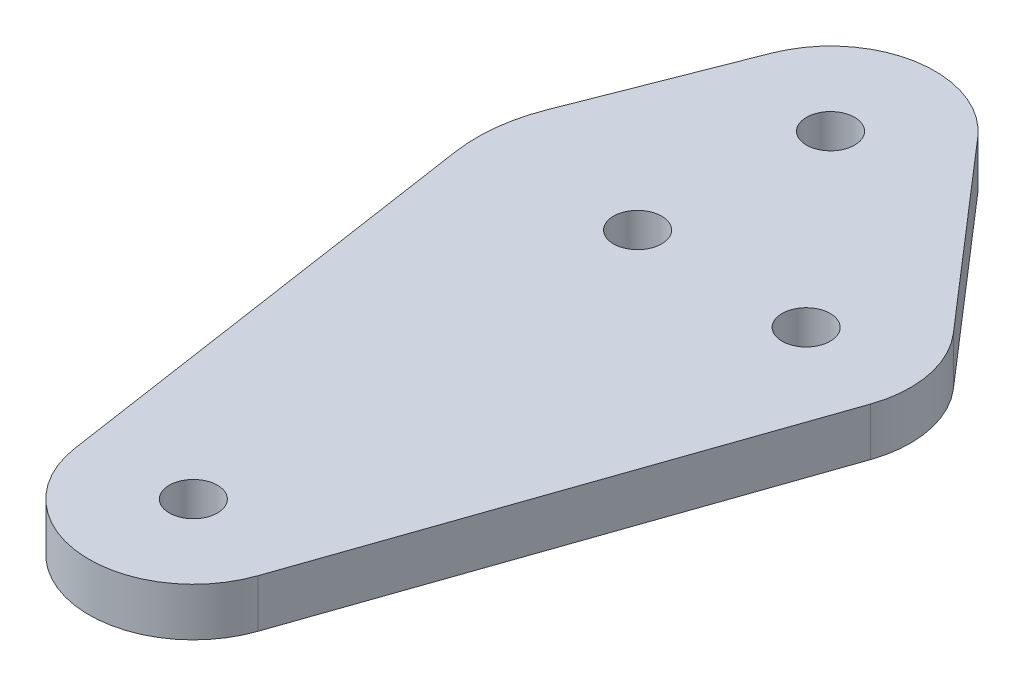
ISO-10303-21;
HEADER;
FILE_DESCRIPTION(('STEP AP214'),'2;1');
FILE_NAME('part.step','',(''),(''),'','','');
FILE_SCHEMA(('AUTOMOTIVE_DESIGN { 1 0 10303 214 1 1 1 1 }'));
ENDSEC;
DATA;
#1=APPLICATION_CONTEXT('core data for automotive mechanical design processes');
#2=APPLICATION_PROTOCOL_DEFINITION('international standard','automotive_design',2000,#1);
#3=PRODUCT_CONTEXT('',#1,'mechanical');
#4=PRODUCT('Part','Part','',(#3));
#5=PRODUCT_RELATED_PRODUCT_CATEGORY('part','',(#4));
#6=PRODUCT_DEFINITION_FORMATION('','',#4);
#7=PRODUCT_DEFINITION_CONTEXT('part definition',#1,'design');
#8=PRODUCT_DEFINITION('design','',#6,#7);
#9=PRODUCT_DEFINITION_SHAPE('','',#8);
#10=(LENGTH_UNIT() NAMED_UNIT(*) SI_UNIT(.MILLI.,.METRE.));
#11=(NAMED_UNIT(*) PLANE_ANGLE_UNIT() SI_UNIT($,.RADIAN.));
#12=(NAMED_UNIT(*) SI_UNIT($,.STERADIAN.) SOLID_ANGLE_UNIT());
#13=UNCERTAINTY_MEASURE_WITH_UNIT(LENGTH_MEASURE(1.E-05),#10,'distance_accuracy_value','');
#14=(GEOMETRIC_REPRESENTATION_CONTEXT(3) GLOBAL_UNCERTAINTY_ASSIGNED_CONTEXT((#13)) GLOBAL_UNIT_ASSIGNED_CONTEXT((#10,
#11,#12)) REPRESENTATION_CONTEXT('',''));
#15=CARTESIAN_POINT('',(0.,0.,0.));
#16=DIRECTION('',(0.,0.,1.));
#17=DIRECTION('',(1.,0.,0.));
#18=AXIS2_PLACEMENT_3D('',#15,#16,#17);
#19=CARTESIAN_POINT('',(-9.81980506061962,3.,-11.3389341902768));
#20=DIRECTION('',(0.,1.,0.));
#21=DIRECTION('',(0.,0.,1.));
#22=AXIS2_PLACEMENT_3D('',#19,#20,#21);
#23=PLANE('',#22);
#24=CARTESIAN_POINT('',(-9.81980506061962,3.,28.347335475692));
#25=DIRECTION('',(0.,1.,0.));
#26=DIRECTION('',(0.,0.,1.));
#27=AXIS2_PLACEMENT_3D('',#24,#25,#26);
#28=CIRCLE('',#27,1.5);
#29=CARTESIAN_POINT('',(-9.81980506061962,3.,29.8473354756921));
#30=VERTEX_POINT('',#29);
#31=EDGE_CURVE('E188',#30,#30,#28,.T.);
#32=ORIENTED_EDGE('',*,*,#31,.F.);
#33=EDGE_LOOP('',(#32));
#34=FACE_BOUND('',#33,.T.);
#35=CARTESIAN_POINT('',(0.,3.,0.));
#36=DIRECTION('',(0.,1.,0.));
#37=DIRECTION('',(0.,0.,1.));
#38=AXIS2_PLACEMENT_3D('',#35,#36,#37);
#39=CIRCLE('',#38,1.5);
#40=CARTESIAN_POINT('',(0.,3.,1.5));
#41=VERTEX_POINT('',#40);
#42=EDGE_CURVE('E134',#41,#41,#39,.T.);
#43=ORIENTED_EDGE('',*,*,#42,.F.);
#44=EDGE_LOOP('',(#43));
#45=FACE_BOUND('',#44,.T.);
#46=CARTESIAN_POINT('',(-9.81980506061962,3.,-11.3389341902768));
#47=DIRECTION('',(0.,1.,0.));
#48=DIRECTION('',(0.,0.,1.));
#49=AXIS2_PLACEMENT_3D('',#46,#47,#48);
#50=CIRCLE('',#49,6.5);
#51=CARTESIAN_POINT('',(-4.90626691149965,3.,-15.5941830498787));
#52=VERTEX_POINT('',#51);
#53=CARTESIAN_POINT('',(-15.8725485224448,3.,-13.7083848830183));
#54=VERTEX_POINT('',#53);
#55=EDGE_CURVE('E145',#52,#54,#50,.T.);
#56=ORIENTED_EDGE('',*,*,#55,.T.);
#57=DIRECTION('',(-0.364530875806377,0.,0.931191301819253));
#58=VECTOR('',#57,1.);
#59=CARTESIAN_POINT('',(-15.8725485224448,3.,-13.7083848830183));
#60=LINE('',#59,#58);
#61=CARTESIAN_POINT('',(-19.8119130181925,3.,-3.64530875806377));
#62=VERTEX_POINT('',#61);
#63=EDGE_CURVE('E93',#54,#62,#60,.T.);
#64=ORIENTED_EDGE('',*,*,#63,.T.);
#65=CARTESIAN_POINT('',(-10.5,3.,0.));
#66=DIRECTION('',(0.,1.,0.));
#67=DIRECTION('',(0.,0.,1.));
#68=AXIS2_PLACEMENT_3D('',#65,#66,#67);
#69=CIRCLE('',#68,10.);
#70=CARTESIAN_POINT('',(-20.3910644709549,3.,1.4720202550963));
#71=VERTEX_POINT('',#70);
#72=EDGE_CURVE('E160',#62,#71,#69,.T.);
#73=ORIENTED_EDGE('',*,*,#72,.T.);
#74=DIRECTION('',(0.14720202550963,0.,0.989106447095489));
#75=VECTOR('',#74,1.);
#76=CARTESIAN_POINT('',(-20.3910644709549,3.,1.4720202550963));
#77=LINE('',#76,#75);
#78=CARTESIAN_POINT('',(-16.2489969667403,3.,29.3041486415046));
#79=VERTEX_POINT('',#78);
#80=EDGE_CURVE('E173',#71,#79,#77,.T.);
#81=ORIENTED_EDGE('',*,*,#80,.T.);
#82=CARTESIAN_POINT('',(-9.81980506061962,3.,28.347335475692));
#83=DIRECTION('',(0.,1.,0.));
#84=DIRECTION('',(0.,0.,1.));
#85=AXIS2_PLACEMENT_3D('',#82,#83,#84);
#86=CIRCLE('',#85,6.5);
#87=CARTESIAN_POINT('',(-3.67788237421967,3.,30.474959905493));
#88=VERTEX_POINT('',#87);
#89=EDGE_CURVE('E112',#79,#88,#86,.T.);
#90=ORIENTED_EDGE('',*,*,#89,.T.);
#91=DIRECTION('',(0.327326835353987,0.,-0.944911182523068));
#92=VECTOR('',#91,1.);
#93=CARTESIAN_POINT('',(6.14192268639994,3.,2.12762442980092));
#94=LINE('',#93,#92);
#95=CARTESIAN_POINT('',(6.14192268639994,3.,2.12762442980092));
#96=VERTEX_POINT('',#95);
#97=EDGE_CURVE('E106',#88,#96,#94,.T.);
#98=ORIENTED_EDGE('',*,*,#97,.T.);
#99=CARTESIAN_POINT('',(0.,3.,0.));
#100=DIRECTION('',(0.,1.,0.));
#101=DIRECTION('',(0.,0.,1.));
#102=AXIS2_PLACEMENT_3D('',#99,#100,#101);
#103=CIRCLE('',#102,6.5);
#104=CARTESIAN_POINT('',(4.91353814911997,3.,-4.25524885960184));
#105=VERTEX_POINT('',#104);
#106=EDGE_CURVE('E110',#96,#105,#103,.T.);
#107=ORIENTED_EDGE('',*,*,#106,.T.);
#108=DIRECTION('',(-0.654653670707975,0.,-0.755928946018457));
#109=VECTOR('',#108,1.);
#110=CARTESIAN_POINT('',(-4.90626691149965,3.,-15.5941830498787));
#111=LINE('',#110,#109);
#112=EDGE_CURVE('E50',#105,#52,#111,.T.);
#113=ORIENTED_EDGE('',*,*,#112,.T.);
#114=EDGE_LOOP('',(#56,#64,#73,#81,#90,#98,#107,#113));
#115=FACE_BOUND('',#114,.T.);
#116=CARTESIAN_POINT('',(-9.81980506061962,3.,-11.3389341902768));
#117=DIRECTION('',(0.,1.,0.));
#118=DIRECTION('',(0.,0.,1.));
#119=AXIS2_PLACEMENT_3D('',#116,#117,#118);
#120=CIRCLE('',#119,1.5);
#121=CARTESIAN_POINT('',(-9.81980506061962,3.,-9.83893419027685));
#122=VERTEX_POINT('',#121);
#123=EDGE_CURVE('E182',#122,#122,#120,.T.);
#124=ORIENTED_EDGE('',*,*,#123,.F.);
#125=EDGE_LOOP('',(#124));
#126=FACE_BOUND('',#125,.T.);
#127=CARTESIAN_POINT('',(-10.5,3.,0.));
#128=DIRECTION('',(0.,1.,0.));
#129=DIRECTION('',(0.,0.,1.));
#130=AXIS2_PLACEMENT_3D('',#127,#128,#129);
#131=CIRCLE('',#130,1.5);
#132=CARTESIAN_POINT('',(-10.5,3.,1.5));
#133=VERTEX_POINT('',#132);
#134=EDGE_CURVE('E194',#133,#133,#131,.T.);
#135=ORIENTED_EDGE('',*,*,#134,.F.);
#136=EDGE_LOOP('',(#135));
#137=FACE_BOUND('',#136,.T.);
#138=ADVANCED_FACE('F33',(#34,#45,#115,#126,#137),#23,.T.);
#139=CARTESIAN_POINT('',(-9.81980506061962,0.,-11.3389341902768));
#140=DIRECTION('',(0.,1.,0.));
#141=DIRECTION('',(0.,0.,1.));
#142=AXIS2_PLACEMENT_3D('',#139,#140,#141);
#143=PLANE('',#142);
#144=CARTESIAN_POINT('',(-9.81980506061962,0.,-11.3389341902768));
#145=DIRECTION('',(0.,1.,0.));
#146=DIRECTION('',(0.,0.,1.));
#147=AXIS2_PLACEMENT_3D('',#144,#145,#146);
#148=CIRCLE('',#147,6.5);
#149=CARTESIAN_POINT('',(-4.90626691149965,0.,-15.5941830498787));
#150=VERTEX_POINT('',#149);
#151=CARTESIAN_POINT('',(-15.8725485224448,0.,-13.7083848830183));
#152=VERTEX_POINT('',#151);
#153=EDGE_CURVE('E130',#150,#152,#148,.T.);
#154=ORIENTED_EDGE('',*,*,#153,.F.);
#155=DIRECTION('',(-0.654653670707975,0.,-0.755928946018457));
#156=VECTOR('',#155,1.);
#157=CARTESIAN_POINT('',(-4.90626691149965,0.,-15.5941830498787));
#158=LINE('',#157,#156);
#159=CARTESIAN_POINT('',(4.91353814911997,0.,-4.25524885960184));
#160=VERTEX_POINT('',#159);
#161=EDGE_CURVE('E85',#160,#150,#158,.T.);
#162=ORIENTED_EDGE('',*,*,#161,.F.);
#163=CARTESIAN_POINT('',(0.,0.,0.));
#164=DIRECTION('',(0.,1.,0.));
#165=DIRECTION('',(0.,0.,1.));
#166=AXIS2_PLACEMENT_3D('',#163,#164,#165);
#167=CIRCLE('',#166,6.5);
#168=CARTESIAN_POINT('',(6.14192268639994,0.,2.12762442980092));
#169=VERTEX_POINT('',#168);
#170=EDGE_CURVE('E79',#169,#160,#167,.T.);
#171=ORIENTED_EDGE('',*,*,#170,.F.);
#172=DIRECTION('',(0.327326835353987,0.,-0.944911182523068));
#173=VECTOR('',#172,1.);
#174=CARTESIAN_POINT('',(6.14192268639994,0.,2.12762442980092));
#175=LINE('',#174,#173);
#176=CARTESIAN_POINT('',(-3.67788237421967,0.,30.474959905493));
#177=VERTEX_POINT('',#176);
#178=EDGE_CURVE('E120',#177,#169,#175,.T.);
#179=ORIENTED_EDGE('',*,*,#178,.F.);
#180=CARTESIAN_POINT('',(-9.81980506061962,0.,28.347335475692));
#181=DIRECTION('',(0.,1.,0.));
#182=DIRECTION('',(0.,0.,1.));
#183=AXIS2_PLACEMENT_3D('',#180,#181,#182);
#184=CIRCLE('',#183,6.5);
#185=CARTESIAN_POINT('',(-16.2489969667403,0.,29.3041486415046));
#186=VERTEX_POINT('',#185);
#187=EDGE_CURVE('E140',#186,#177,#184,.T.);
#188=ORIENTED_EDGE('',*,*,#187,.F.);
#189=DIRECTION('',(0.14720202550963,0.,0.989106447095489));
#190=VECTOR('',#189,1.);
#191=CARTESIAN_POINT('',(-20.3910644709549,0.,1.4720202550963));
#192=LINE('',#191,#190);
#193=CARTESIAN_POINT('',(-20.3910644709549,0.,1.4720202550963));
#194=VERTEX_POINT('',#193);
#195=EDGE_CURVE('E138',#194,#186,#192,.T.);
#196=ORIENTED_EDGE('',*,*,#195,.F.);
#197=CARTESIAN_POINT('',(-10.5,0.,0.));
#198=DIRECTION('',(0.,1.,0.));
#199=DIRECTION('',(0.,0.,1.));
#200=AXIS2_PLACEMENT_3D('',#197,#198,#199);
#201=CIRCLE('',#200,10.);
#202=CARTESIAN_POINT('',(-19.8119130181925,0.,-3.64530875806377));
#203=VERTEX_POINT('',#202);
#204=EDGE_CURVE('E136',#203,#194,#201,.T.);
#205=ORIENTED_EDGE('',*,*,#204,.F.);
#206=DIRECTION('',(-0.364530875806377,0.,0.931191301819253));
#207=VECTOR('',#206,1.);
#208=CARTESIAN_POINT('',(-15.8725485224448,0.,-13.7083848830183));
#209=LINE('',#208,#207);
#210=EDGE_CURVE('E133',#152,#203,#209,.T.);
#211=ORIENTED_EDGE('',*,*,#210,.F.);
#212=EDGE_LOOP('',(#154,#162,#171,#179,#188,#196,#205,#211));
#213=FACE_BOUND('',#212,.T.);
#214=CARTESIAN_POINT('',(0.,0.,0.));
#215=DIRECTION('',(0.,1.,0.));
#216=DIRECTION('',(0.,0.,1.));
#217=AXIS2_PLACEMENT_3D('',#214,#215,#216);
#218=CIRCLE('',#217,1.5);
#219=CARTESIAN_POINT('',(0.,0.,1.5));
#220=VERTEX_POINT('',#219);
#221=EDGE_CURVE('E179',#220,#220,#218,.T.);
#222=ORIENTED_EDGE('',*,*,#221,.T.);
#223=EDGE_LOOP('',(#222));
#224=FACE_BOUND('',#223,.T.);
#225=CARTESIAN_POINT('',(-9.81980506061962,0.,-11.3389341902768));
#226=DIRECTION('',(0.,1.,0.));
#227=DIRECTION('',(0.,0.,1.));
#228=AXIS2_PLACEMENT_3D('',#225,#226,#227);
#229=CIRCLE('',#228,1.5);
#230=CARTESIAN_POINT('',(-9.81980506061962,0.,-9.83893419027685));
#231=VERTEX_POINT('',#230);
#232=EDGE_CURVE('E185',#231,#231,#229,.T.);
#233=ORIENTED_EDGE('',*,*,#232,.T.);
#234=EDGE_LOOP('',(#233));
#235=FACE_BOUND('',#234,.T.);
#236=CARTESIAN_POINT('',(-9.81980506061962,0.,28.347335475692));
#237=DIRECTION('',(0.,1.,0.));
#238=DIRECTION('',(0.,0.,1.));
#239=AXIS2_PLACEMENT_3D('',#236,#237,#238);
#240=CIRCLE('',#239,1.5);
#241=CARTESIAN_POINT('',(-9.81980506061962,0.,29.8473354756921));
#242=VERTEX_POINT('',#241);
#243=EDGE_CURVE('E191',#242,#242,#240,.T.);
#244=ORIENTED_EDGE('',*,*,#243,.T.);
#245=EDGE_LOOP('',(#244));
#246=FACE_BOUND('',#245,.T.);
#247=CARTESIAN_POINT('',(-10.5,0.,0.));
#248=DIRECTION('',(0.,1.,0.));
#249=DIRECTION('',(0.,0.,1.));
#250=AXIS2_PLACEMENT_3D('',#247,#248,#249);
#251=CIRCLE('',#250,1.5);
#252=CARTESIAN_POINT('',(-10.5,0.,1.5));
#253=VERTEX_POINT('',#252);
#254=EDGE_CURVE('E197',#253,#253,#251,.T.);
#255=ORIENTED_EDGE('',*,*,#254,.T.);
#256=EDGE_LOOP('',(#255));
#257=FACE_BOUND('',#256,.T.);
#258=ADVANCED_FACE('F164',(#213,#224,#235,#246,#257),#143,.F.);
#259=CARTESIAN_POINT('',(-9.81980506061962,3.,-11.3389341902768));
#260=DIRECTION('',(0.,-1.,0.));
#261=DIRECTION('',(0.,0.,-1.));
#262=AXIS2_PLACEMENT_3D('',#259,#260,#261);
#263=CYLINDRICAL_SURFACE('',#262,6.5);
#264=ORIENTED_EDGE('',*,*,#153,.T.);
#265=DIRECTION('',(0.,-1.,0.));
#266=VECTOR('',#265,1.);
#267=CARTESIAN_POINT('',(-15.8725485224448,3.,-13.7083848830183));
#268=LINE('',#267,#266);
#269=EDGE_CURVE('E11',#54,#152,#268,.T.);
#270=ORIENTED_EDGE('',*,*,#269,.F.);
#271=ORIENTED_EDGE('',*,*,#55,.F.);
#272=DIRECTION('',(0.,-1.,0.));
#273=VECTOR('',#272,1.);
#274=CARTESIAN_POINT('',(-4.90626691149965,3.,-15.5941830498787));
#275=LINE('',#274,#273);
#276=EDGE_CURVE('E126',#52,#150,#275,.T.);
#277=ORIENTED_EDGE('',*,*,#276,.T.);
#278=EDGE_LOOP('',(#264,#270,#271,#277));
#279=FACE_BOUND('',#278,.T.);
#280=ADVANCED_FACE('F35',(#279),#263,.T.);
#281=CARTESIAN_POINT('',(-15.8725485224448,3.,-13.7083848830183));
#282=DIRECTION('',(0.931191301819253,0.,0.364530875806377));
#283=DIRECTION('',(0.364530875806377,0.,-0.931191301819253));
#284=AXIS2_PLACEMENT_3D('',#281,#282,#283);
#285=PLANE('',#284);
#286=ORIENTED_EDGE('',*,*,#210,.T.);
#287=DIRECTION('',(0.,-1.,0.));
#288=VECTOR('',#287,1.);
#289=CARTESIAN_POINT('',(-19.8119130181925,3.,-3.64530875806377));
#290=LINE('',#289,#288);
#291=EDGE_CURVE('E42',#62,#203,#290,.T.);
#292=ORIENTED_EDGE('',*,*,#291,.F.);
#293=ORIENTED_EDGE('',*,*,#63,.F.);
#294=ORIENTED_EDGE('',*,*,#269,.T.);
#295=EDGE_LOOP('',(#286,#292,#293,#294));
#296=FACE_BOUND('',#295,.T.);
#297=ADVANCED_FACE('F231',(#296),#285,.F.);
#298=CARTESIAN_POINT('',(-10.5,3.,0.));
#299=DIRECTION('',(0.,-1.,0.));
#300=DIRECTION('',(0.,0.,-1.));
#301=AXIS2_PLACEMENT_3D('',#298,#299,#300);
#302=CYLINDRICAL_SURFACE('',#301,10.);
#303=ORIENTED_EDGE('',*,*,#204,.T.);
#304=DIRECTION('',(0.,-1.,0.));
#305=VECTOR('',#304,1.);
#306=CARTESIAN_POINT('',(-20.3910644709549,3.,1.4720202550963));
#307=LINE('',#306,#305);
#308=EDGE_CURVE('E152',#71,#194,#307,.T.);
#309=ORIENTED_EDGE('',*,*,#308,.F.);
#310=ORIENTED_EDGE('',*,*,#72,.F.);
#311=ORIENTED_EDGE('',*,*,#291,.T.);
#312=EDGE_LOOP('',(#303,#309,#310,#311));
#313=FACE_BOUND('',#312,.T.);
#314=ADVANCED_FACE('F158',(#313),#302,.T.);
#315=CARTESIAN_POINT('',(-20.3910644709549,3.,1.4720202550963));
#316=DIRECTION('',(0.989106447095489,0.,-0.14720202550963));
#317=DIRECTION('',(-0.14720202550963,0.,-0.98910644709549));
#318=AXIS2_PLACEMENT_3D('',#315,#316,#317);
#319=PLANE('',#318);
#320=ORIENTED_EDGE('',*,*,#195,.T.);
#321=DIRECTION('',(0.,-1.,0.));
#322=VECTOR('',#321,1.);
#323=CARTESIAN_POINT('',(-16.2489969667403,3.,29.3041486415046));
#324=LINE('',#323,#322);
#325=EDGE_CURVE('E149',#79,#186,#324,.T.);
#326=ORIENTED_EDGE('',*,*,#325,.F.);
#327=ORIENTED_EDGE('',*,*,#80,.F.);
#328=ORIENTED_EDGE('',*,*,#308,.T.);
#329=EDGE_LOOP('',(#320,#326,#327,#328));
#330=FACE_BOUND('',#329,.T.);
#331=ADVANCED_FACE('F169',(#330),#319,.F.);
#332=CARTESIAN_POINT('',(-9.81980506061962,3.,28.347335475692));
#333=DIRECTION('',(0.,-1.,0.));
#334=DIRECTION('',(0.,0.,-1.));
#335=AXIS2_PLACEMENT_3D('',#332,#333,#334);
#336=CYLINDRICAL_SURFACE('',#335,6.5);
#337=ORIENTED_EDGE('',*,*,#187,.T.);
#338=DIRECTION('',(0.,-1.,0.));
#339=VECTOR('',#338,1.);
#340=CARTESIAN_POINT('',(-3.67788237421967,3.,30.474959905493));
#341=LINE('',#340,#339);
#342=EDGE_CURVE('E121',#88,#177,#341,.T.);
#343=ORIENTED_EDGE('',*,*,#342,.F.);
#344=ORIENTED_EDGE('',*,*,#89,.F.);
#345=ORIENTED_EDGE('',*,*,#325,.T.);
#346=EDGE_LOOP('',(#337,#343,#344,#345));
#347=FACE_BOUND('',#346,.T.);
#348=ADVANCED_FACE('F172',(#347),#336,.T.);
#349=CARTESIAN_POINT('',(6.14192268639994,3.,2.12762442980092));
#350=DIRECTION('',(-0.944911182523068,0.,-0.327326835353987));
#351=DIRECTION('',(-0.327326835353987,0.,0.944911182523069));
#352=AXIS2_PLACEMENT_3D('',#349,#350,#351);
#353=PLANE('',#352);
#354=ORIENTED_EDGE('',*,*,#178,.T.);
#355=DIRECTION('',(0.,-1.,0.));
#356=VECTOR('',#355,1.);
#357=CARTESIAN_POINT('',(6.14192268639994,3.,2.12762442980092));
#358=LINE('',#357,#356);
#359=EDGE_CURVE('E117',#96,#169,#358,.T.);
#360=ORIENTED_EDGE('',*,*,#359,.F.);
#361=ORIENTED_EDGE('',*,*,#97,.F.);
#362=ORIENTED_EDGE('',*,*,#342,.T.);
#363=EDGE_LOOP('',(#354,#360,#361,#362));
#364=FACE_BOUND('',#363,.T.);
#365=ADVANCED_FACE('F118',(#364),#353,.F.);
#366=CARTESIAN_POINT('',(0.,3.,0.));
#367=DIRECTION('',(0.,-1.,0.));
#368=DIRECTION('',(0.,0.,-1.));
#369=AXIS2_PLACEMENT_3D('',#366,#367,#368);
#370=CYLINDRICAL_SURFACE('',#369,6.5);
#371=ORIENTED_EDGE('',*,*,#170,.T.);
#372=DIRECTION('',(0.,-1.,0.));
#373=VECTOR('',#372,1.);
#374=CARTESIAN_POINT('',(4.91353814911997,3.,-4.25524885960184));
#375=LINE('',#374,#373);
#376=EDGE_CURVE('E122',#105,#160,#375,.T.);
#377=ORIENTED_EDGE('',*,*,#376,.F.);
#378=ORIENTED_EDGE('',*,*,#106,.F.);
#379=ORIENTED_EDGE('',*,*,#359,.T.);
#380=EDGE_LOOP('',(#371,#377,#378,#379));
#381=FACE_BOUND('',#380,.T.);
#382=ADVANCED_FACE('F124',(#381),#370,.T.);
#383=CARTESIAN_POINT('',(-4.90626691149965,3.,-15.5941830498787));
#384=DIRECTION('',(-0.755928946018457,0.,0.654653670707975));
#385=DIRECTION('',(0.654653670707975,0.,0.755928946018457));
#386=AXIS2_PLACEMENT_3D('',#383,#384,#385);
#387=PLANE('',#386);
#388=ORIENTED_EDGE('',*,*,#161,.T.);
#389=ORIENTED_EDGE('',*,*,#276,.F.);
#390=ORIENTED_EDGE('',*,*,#112,.F.);
#391=ORIENTED_EDGE('',*,*,#376,.T.);
#392=EDGE_LOOP('',(#388,#389,#390,#391));
#393=FACE_BOUND('',#392,.T.);
#394=ADVANCED_FACE('F219',(#393),#387,.F.);
#395=CARTESIAN_POINT('',(0.,3.,0.));
#396=DIRECTION('',(0.,-1.,0.));
#397=DIRECTION('',(0.,0.,-1.));
#398=AXIS2_PLACEMENT_3D('',#395,#396,#397);
#399=CYLINDRICAL_SURFACE('',#398,1.5);
#400=ORIENTED_EDGE('',*,*,#42,.T.);
#401=EDGE_LOOP('',(#400));
#402=FACE_BOUND('',#401,.T.);
#403=ORIENTED_EDGE('',*,*,#221,.F.);
#404=EDGE_LOOP('',(#403));
#405=FACE_BOUND('',#404,.T.);
#406=ADVANCED_FACE('F216',(#402,#405),#399,.F.);
#407=CARTESIAN_POINT('',(-9.81980506061962,3.,-11.3389341902768));
#408=DIRECTION('',(0.,-1.,0.));
#409=DIRECTION('',(0.,0.,-1.));
#410=AXIS2_PLACEMENT_3D('',#407,#408,#409);
#411=CYLINDRICAL_SURFACE('',#410,1.5);
#412=ORIENTED_EDGE('',*,*,#123,.T.);
#413=EDGE_LOOP('',(#412));
#414=FACE_BOUND('',#413,.T.);
#415=ORIENTED_EDGE('',*,*,#232,.F.);
#416=EDGE_LOOP('',(#415));
#417=FACE_BOUND('',#416,.T.);
#418=ADVANCED_FACE('F295',(#414,#417),#411,.F.);
#419=CARTESIAN_POINT('',(-9.81980506061962,3.,28.347335475692));
#420=DIRECTION('',(0.,-1.,0.));
#421=DIRECTION('',(0.,0.,-1.));
#422=AXIS2_PLACEMENT_3D('',#419,#420,#421);
#423=CYLINDRICAL_SURFACE('',#422,1.5);
#424=ORIENTED_EDGE('',*,*,#31,.T.);
#425=EDGE_LOOP('',(#424));
#426=FACE_BOUND('',#425,.T.);
#427=ORIENTED_EDGE('',*,*,#243,.F.);
#428=EDGE_LOOP('',(#427));
#429=FACE_BOUND('',#428,.T.);
#430=ADVANCED_FACE('F303',(#426,#429),#423,.F.);
#431=CARTESIAN_POINT('',(-10.5,3.,0.));
#432=DIRECTION('',(0.,-1.,0.));
#433=DIRECTION('',(0.,0.,-1.));
#434=AXIS2_PLACEMENT_3D('',#431,#432,#433);
#435=CYLINDRICAL_SURFACE('',#434,1.5);
#436=ORIENTED_EDGE('',*,*,#134,.T.);
#437=EDGE_LOOP('',(#436));
#438=FACE_BOUND('',#437,.T.);
#439=ORIENTED_EDGE('',*,*,#254,.F.);
#440=EDGE_LOOP('',(#439));
#441=FACE_BOUND('',#440,.T.);
#442=ADVANCED_FACE('F203',(#438,#441),#435,.F.);
#443=CLOSED_SHELL('',(#138,#258,#280,#297,#314,#331,#348,#365,#382,#394,#406,#418,#430,#442));
#444=MANIFOLD_SOLID_BREP('B2',#443);
#445=ADVANCED_BREP_SHAPE_REPRESENTATION('',(#18,#444),#14);
#446=SHAPE_DEFINITION_REPRESENTATION(#9,#445);
ENDSEC;
END-ISO-10303-21;
